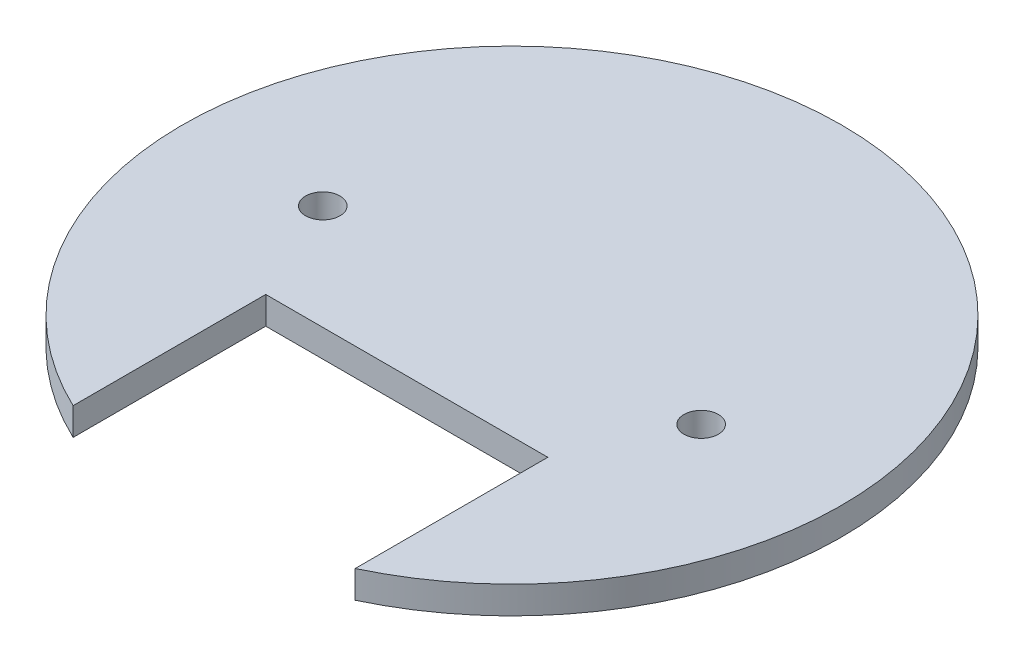
ISO-10303-21;
HEADER;
FILE_DESCRIPTION(('STEP AP214'),'2;1');
FILE_NAME('part.step','',(''),(''),'','','');
FILE_SCHEMA(('AUTOMOTIVE_DESIGN { 1 0 10303 214 1 1 1 1 }'));
ENDSEC;
DATA;
#1=APPLICATION_CONTEXT('core data for automotive mechanical design processes');
#2=APPLICATION_PROTOCOL_DEFINITION('international standard','automotive_design',2000,#1);
#3=PRODUCT_CONTEXT('',#1,'mechanical');
#4=PRODUCT('Part','Part','',(#3));
#5=PRODUCT_RELATED_PRODUCT_CATEGORY('part','',(#4));
#6=PRODUCT_DEFINITION_FORMATION('','',#4);
#7=PRODUCT_DEFINITION_CONTEXT('part definition',#1,'design');
#8=PRODUCT_DEFINITION('design','',#6,#7);
#9=PRODUCT_DEFINITION_SHAPE('','',#8);
#10=(LENGTH_UNIT() NAMED_UNIT(*) SI_UNIT(.MILLI.,.METRE.));
#11=(NAMED_UNIT(*) PLANE_ANGLE_UNIT() SI_UNIT($,.RADIAN.));
#12=(NAMED_UNIT(*) SI_UNIT($,.STERADIAN.) SOLID_ANGLE_UNIT());
#13=UNCERTAINTY_MEASURE_WITH_UNIT(LENGTH_MEASURE(1.E-05),#10,'distance_accuracy_value','');
#14=(GEOMETRIC_REPRESENTATION_CONTEXT(3) GLOBAL_UNCERTAINTY_ASSIGNED_CONTEXT((#13)) GLOBAL_UNIT_ASSIGNED_CONTEXT((#10,
#11,#12)) REPRESENTATION_CONTEXT('',''));
#15=CARTESIAN_POINT('',(0.,0.,0.));
#16=DIRECTION('',(0.,0.,1.));
#17=DIRECTION('',(1.,0.,0.));
#18=AXIS2_PLACEMENT_3D('',#15,#16,#17);
#19=CARTESIAN_POINT('',(0.,4.,0.));
#20=DIRECTION('',(0.,1.,0.));
#21=DIRECTION('',(0.,0.,1.));
#22=AXIS2_PLACEMENT_3D('',#19,#20,#21);
#23=PLANE('',#22);
#24=CARTESIAN_POINT('',(-27.5,4.,0.));
#25=DIRECTION('',(0.,1.,0.));
#26=DIRECTION('',(0.,0.,1.));
#27=AXIS2_PLACEMENT_3D('',#24,#25,#26);
#28=CIRCLE('',#27,2.5);
#29=CARTESIAN_POINT('',(-27.5,4.,2.5));
#30=VERTEX_POINT('',#29);
#31=EDGE_CURVE('E100',#30,#30,#28,.T.);
#32=ORIENTED_EDGE('',*,*,#31,.F.);
#33=EDGE_LOOP('',(#32));
#34=FACE_BOUND('',#33,.T.);
#35=CARTESIAN_POINT('',(0.,4.,0.));
#36=DIRECTION('',(0.,1.,0.));
#37=DIRECTION('',(0.,0.,1.));
#38=AXIS2_PLACEMENT_3D('',#35,#36,#37);
#39=CIRCLE('',#38,47.9);
#40=CARTESIAN_POINT('',(20.5,4.,43.2915696181139));
#41=VERTEX_POINT('',#40);
#42=CARTESIAN_POINT('',(-20.5,4.,43.2915696181139));
#43=VERTEX_POINT('',#42);
#44=EDGE_CURVE('E85',#41,#43,#39,.T.);
#45=ORIENTED_EDGE('',*,*,#44,.T.);
#46=DIRECTION('',(0.,0.,-1.));
#47=VECTOR('',#46,1.);
#48=CARTESIAN_POINT('',(-20.5,4.,43.2915696181139));
#49=LINE('',#48,#47);
#50=CARTESIAN_POINT('',(-20.5,4.,15.2915696181139));
#51=VERTEX_POINT('',#50);
#52=EDGE_CURVE('E80',#43,#51,#49,.T.);
#53=ORIENTED_EDGE('',*,*,#52,.T.);
#54=DIRECTION('',(1.,0.,0.));
#55=VECTOR('',#54,1.);
#56=CARTESIAN_POINT('',(-20.5,4.,15.2915696181139));
#57=LINE('',#56,#55);
#58=CARTESIAN_POINT('',(20.5,4.,15.2915696181139));
#59=VERTEX_POINT('',#58);
#60=EDGE_CURVE('E83',#51,#59,#57,.T.);
#61=ORIENTED_EDGE('',*,*,#60,.T.);
#62=DIRECTION('',(0.,0.,1.));
#63=VECTOR('',#62,1.);
#64=CARTESIAN_POINT('',(20.5,4.,15.2915696181139));
#65=LINE('',#64,#63);
#66=EDGE_CURVE('E50',#59,#41,#65,.T.);
#67=ORIENTED_EDGE('',*,*,#66,.T.);
#68=EDGE_LOOP('',(#45,#53,#61,#67));
#69=FACE_BOUND('',#68,.T.);
#70=CARTESIAN_POINT('',(27.5,4.,0.));
#71=DIRECTION('',(0.,1.,0.));
#72=DIRECTION('',(0.,0.,-1.));
#73=AXIS2_PLACEMENT_3D('',#70,#71,#72);
#74=CIRCLE('',#73,2.5);
#75=CARTESIAN_POINT('',(27.5,4.,-2.50000000000001));
#76=VERTEX_POINT('',#75);
#77=EDGE_CURVE('E115',#76,#76,#74,.T.);
#78=ORIENTED_EDGE('',*,*,#77,.F.);
#79=EDGE_LOOP('',(#78));
#80=FACE_BOUND('',#79,.T.);
#81=ADVANCED_FACE('F33',(#34,#69,#80),#23,.T.);
#82=CARTESIAN_POINT('',(0.,0.,0.));
#83=DIRECTION('',(0.,1.,0.));
#84=DIRECTION('',(0.,0.,1.));
#85=AXIS2_PLACEMENT_3D('',#82,#83,#84);
#86=PLANE('',#85);
#87=CARTESIAN_POINT('',(0.,0.,0.));
#88=DIRECTION('',(0.,1.,0.));
#89=DIRECTION('',(0.,0.,1.));
#90=AXIS2_PLACEMENT_3D('',#87,#88,#89);
#91=CIRCLE('',#90,47.9);
#92=CARTESIAN_POINT('',(20.5,0.,43.2915696181139));
#93=VERTEX_POINT('',#92);
#94=CARTESIAN_POINT('',(-20.5,0.,43.2915696181139));
#95=VERTEX_POINT('',#94);
#96=EDGE_CURVE('E97',#93,#95,#91,.T.);
#97=ORIENTED_EDGE('',*,*,#96,.F.);
#98=DIRECTION('',(0.,0.,1.));
#99=VECTOR('',#98,1.);
#100=CARTESIAN_POINT('',(20.5,0.,15.2915696181139));
#101=LINE('',#100,#99);
#102=CARTESIAN_POINT('',(20.5,0.,15.2915696181139));
#103=VERTEX_POINT('',#102);
#104=EDGE_CURVE('E73',#103,#93,#101,.T.);
#105=ORIENTED_EDGE('',*,*,#104,.F.);
#106=DIRECTION('',(1.,0.,0.));
#107=VECTOR('',#106,1.);
#108=CARTESIAN_POINT('',(-20.5,0.,15.2915696181139));
#109=LINE('',#108,#107);
#110=CARTESIAN_POINT('',(-20.5,0.,15.2915696181139));
#111=VERTEX_POINT('',#110);
#112=EDGE_CURVE('E67',#111,#103,#109,.T.);
#113=ORIENTED_EDGE('',*,*,#112,.F.);
#114=DIRECTION('',(0.,0.,-1.));
#115=VECTOR('',#114,1.);
#116=CARTESIAN_POINT('',(-20.5,0.,43.2915696181139));
#117=LINE('',#116,#115);
#118=EDGE_CURVE('E89',#95,#111,#117,.T.);
#119=ORIENTED_EDGE('',*,*,#118,.F.);
#120=EDGE_LOOP('',(#97,#105,#113,#119));
#121=FACE_BOUND('',#120,.T.);
#122=CARTESIAN_POINT('',(-27.5,0.,0.));
#123=DIRECTION('',(0.,1.,0.));
#124=DIRECTION('',(0.,0.,1.));
#125=AXIS2_PLACEMENT_3D('',#122,#123,#124);
#126=CIRCLE('',#125,2.5);
#127=CARTESIAN_POINT('',(-27.5,0.,2.5));
#128=VERTEX_POINT('',#127);
#129=EDGE_CURVE('E112',#128,#128,#126,.T.);
#130=ORIENTED_EDGE('',*,*,#129,.T.);
#131=EDGE_LOOP('',(#130));
#132=FACE_BOUND('',#131,.T.);
#133=CARTESIAN_POINT('',(27.5,0.,0.));
#134=DIRECTION('',(0.,1.,0.));
#135=DIRECTION('',(0.,0.,-1.));
#136=AXIS2_PLACEMENT_3D('',#133,#134,#135);
#137=CIRCLE('',#136,2.5);
#138=CARTESIAN_POINT('',(27.5,0.,-2.50000000000001));
#139=VERTEX_POINT('',#138);
#140=EDGE_CURVE('E118',#139,#139,#137,.T.);
#141=ORIENTED_EDGE('',*,*,#140,.T.);
#142=EDGE_LOOP('',(#141));
#143=FACE_BOUND('',#142,.T.);
#144=ADVANCED_FACE('F108',(#121,#132,#143),#86,.F.);
#145=CARTESIAN_POINT('',(0.,4.,0.));
#146=DIRECTION('',(0.,-1.,0.));
#147=DIRECTION('',(0.,0.,-1.));
#148=AXIS2_PLACEMENT_3D('',#145,#146,#147);
#149=CYLINDRICAL_SURFACE('',#148,47.9);
#150=ORIENTED_EDGE('',*,*,#96,.T.);
#151=DIRECTION('',(0.,-1.,0.));
#152=VECTOR('',#151,1.);
#153=CARTESIAN_POINT('',(-20.5,4.,43.2915696181139));
#154=LINE('',#153,#152);
#155=EDGE_CURVE('E11',#43,#95,#154,.T.);
#156=ORIENTED_EDGE('',*,*,#155,.F.);
#157=ORIENTED_EDGE('',*,*,#44,.F.);
#158=DIRECTION('',(0.,-1.,0.));
#159=VECTOR('',#158,1.);
#160=CARTESIAN_POINT('',(20.5,4.,43.2915696181139));
#161=LINE('',#160,#159);
#162=EDGE_CURVE('E93',#41,#93,#161,.T.);
#163=ORIENTED_EDGE('',*,*,#162,.T.);
#164=EDGE_LOOP('',(#150,#156,#157,#163));
#165=FACE_BOUND('',#164,.T.);
#166=ADVANCED_FACE('F35',(#165),#149,.T.);
#167=CARTESIAN_POINT('',(-20.5,4.,43.2915696181139));
#168=DIRECTION('',(-1.,0.,0.));
#169=DIRECTION('',(0.,0.,1.));
#170=AXIS2_PLACEMENT_3D('',#167,#168,#169);
#171=PLANE('',#170);
#172=ORIENTED_EDGE('',*,*,#118,.T.);
#173=DIRECTION('',(0.,-1.,0.));
#174=VECTOR('',#173,1.);
#175=CARTESIAN_POINT('',(-20.5,4.,15.2915696181139));
#176=LINE('',#175,#174);
#177=EDGE_CURVE('E42',#51,#111,#176,.T.);
#178=ORIENTED_EDGE('',*,*,#177,.F.);
#179=ORIENTED_EDGE('',*,*,#52,.F.);
#180=ORIENTED_EDGE('',*,*,#155,.T.);
#181=EDGE_LOOP('',(#172,#178,#179,#180));
#182=FACE_BOUND('',#181,.T.);
#183=ADVANCED_FACE('F88',(#182),#171,.F.);
#184=CARTESIAN_POINT('',(-20.5,4.,15.2915696181139));
#185=DIRECTION('',(0.,0.,-1.));
#186=DIRECTION('',(-1.,0.,0.));
#187=AXIS2_PLACEMENT_3D('',#184,#185,#186);
#188=PLANE('',#187);
#189=ORIENTED_EDGE('',*,*,#112,.T.);
#190=DIRECTION('',(0.,-1.,0.));
#191=VECTOR('',#190,1.);
#192=CARTESIAN_POINT('',(20.5,4.,15.2915696181139));
#193=LINE('',#192,#191);
#194=EDGE_CURVE('E90',#59,#103,#193,.T.);
#195=ORIENTED_EDGE('',*,*,#194,.F.);
#196=ORIENTED_EDGE('',*,*,#60,.F.);
#197=ORIENTED_EDGE('',*,*,#177,.T.);
#198=EDGE_LOOP('',(#189,#195,#196,#197));
#199=FACE_BOUND('',#198,.T.);
#200=ADVANCED_FACE('F91',(#199),#188,.F.);
#201=CARTESIAN_POINT('',(20.5,4.,15.2915696181139));
#202=DIRECTION('',(1.,0.,0.));
#203=DIRECTION('',(0.,0.,-1.));
#204=AXIS2_PLACEMENT_3D('',#201,#202,#203);
#205=PLANE('',#204);
#206=ORIENTED_EDGE('',*,*,#104,.T.);
#207=ORIENTED_EDGE('',*,*,#162,.F.);
#208=ORIENTED_EDGE('',*,*,#66,.F.);
#209=ORIENTED_EDGE('',*,*,#194,.T.);
#210=EDGE_LOOP('',(#206,#207,#208,#209));
#211=FACE_BOUND('',#210,.T.);
#212=ADVANCED_FACE('F105',(#211),#205,.F.);
#213=CARTESIAN_POINT('',(-27.5,4.,0.));
#214=DIRECTION('',(0.,-1.,0.));
#215=DIRECTION('',(0.,0.,-1.));
#216=AXIS2_PLACEMENT_3D('',#213,#214,#215);
#217=CYLINDRICAL_SURFACE('',#216,2.5);
#218=ORIENTED_EDGE('',*,*,#31,.T.);
#219=EDGE_LOOP('',(#218));
#220=FACE_BOUND('',#219,.T.);
#221=ORIENTED_EDGE('',*,*,#129,.F.);
#222=EDGE_LOOP('',(#221));
#223=FACE_BOUND('',#222,.T.);
#224=ADVANCED_FACE('F135',(#220,#223),#217,.F.);
#225=CARTESIAN_POINT('',(27.5,4.,0.));
#226=DIRECTION('',(0.,-1.,0.));
#227=DIRECTION('',(0.,0.,-1.));
#228=AXIS2_PLACEMENT_3D('',#225,#226,#227);
#229=CYLINDRICAL_SURFACE('',#228,2.5);
#230=ORIENTED_EDGE('',*,*,#77,.T.);
#231=EDGE_LOOP('',(#230));
#232=FACE_BOUND('',#231,.T.);
#233=ORIENTED_EDGE('',*,*,#140,.F.);
#234=EDGE_LOOP('',(#233));
#235=FACE_BOUND('',#234,.T.);
#236=ADVANCED_FACE('F124',(#232,#235),#229,.F.);
#237=CLOSED_SHELL('',(#81,#144,#166,#183,#200,#212,#224,#236));
#238=MANIFOLD_SOLID_BREP('B2',#237);
#239=ADVANCED_BREP_SHAPE_REPRESENTATION('',(#18,#238),#14);
#240=SHAPE_DEFINITION_REPRESENTATION(#9,#239);
ENDSEC;
END-ISO-10303-21;
